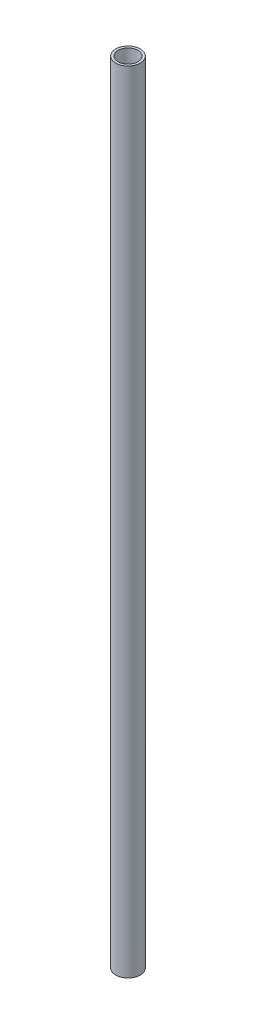
ISO-10303-21;
HEADER;
FILE_DESCRIPTION(('STEP AP214'),'2;1');
FILE_NAME('part.step','',(''),(''),'','','');
FILE_SCHEMA(('AUTOMOTIVE_DESIGN { 1 0 10303 214 1 1 1 1 }'));
ENDSEC;
DATA;
#1=APPLICATION_CONTEXT('core data for automotive mechanical design processes');
#2=APPLICATION_PROTOCOL_DEFINITION('international standard','automotive_design',2000,#1);
#3=PRODUCT_CONTEXT('',#1,'mechanical');
#4=PRODUCT('Part','Part','',(#3));
#5=PRODUCT_RELATED_PRODUCT_CATEGORY('part','',(#4));
#6=PRODUCT_DEFINITION_FORMATION('','',#4);
#7=PRODUCT_DEFINITION_CONTEXT('part definition',#1,'design');
#8=PRODUCT_DEFINITION('design','',#6,#7);
#9=PRODUCT_DEFINITION_SHAPE('','',#8);
#10=(LENGTH_UNIT() NAMED_UNIT(*) SI_UNIT(.MILLI.,.METRE.));
#11=(NAMED_UNIT(*) PLANE_ANGLE_UNIT() SI_UNIT($,.RADIAN.));
#12=(NAMED_UNIT(*) SI_UNIT($,.STERADIAN.) SOLID_ANGLE_UNIT());
#13=UNCERTAINTY_MEASURE_WITH_UNIT(LENGTH_MEASURE(1.E-05),#10,'distance_accuracy_value','');
#14=(GEOMETRIC_REPRESENTATION_CONTEXT(3) GLOBAL_UNCERTAINTY_ASSIGNED_CONTEXT((#13)) GLOBAL_UNIT_ASSIGNED_CONTEXT((#10,
#11,#12)) REPRESENTATION_CONTEXT('',''));
#15=CARTESIAN_POINT('',(0.,0.,0.));
#16=DIRECTION('',(0.,0.,1.));
#17=DIRECTION('',(1.,0.,0.));
#18=AXIS2_PLACEMENT_3D('',#15,#16,#17);
#19=CARTESIAN_POINT('',(0.,0.,0.));
#20=DIRECTION('',(0.,1.,0.));
#21=DIRECTION('',(0.,0.,-1.));
#22=AXIS2_PLACEMENT_3D('',#19,#20,#21);
#23=PLANE('',#22);
#24=CARTESIAN_POINT('',(0.,0.,0.));
#25=DIRECTION('',(0.,-1.,0.));
#26=DIRECTION('',(0.,0.,-1.));
#27=AXIS2_PLACEMENT_3D('',#24,#25,#26);
#28=CIRCLE('',#27,0.3977);
#29=CARTESIAN_POINT('',(0.,0.,-0.3977));
#30=VERTEX_POINT('',#29);
#31=EDGE_CURVE('E40',#30,#30,#28,.T.);
#32=ORIENTED_EDGE('',*,*,#31,.T.);
#33=EDGE_LOOP('',(#32));
#34=FACE_BOUND('',#33,.T.);
#35=CARTESIAN_POINT('',(0.,0.,0.));
#36=DIRECTION('',(0.,-1.,0.));
#37=DIRECTION('',(0.,0.,-1.));
#38=AXIS2_PLACEMENT_3D('',#35,#36,#37);
#39=CIRCLE('',#38,0.3215);
#40=CARTESIAN_POINT('',(0.,0.,-0.3215));
#41=VERTEX_POINT('',#40);
#42=EDGE_CURVE('E49',#41,#41,#39,.T.);
#43=ORIENTED_EDGE('',*,*,#42,.F.);
#44=EDGE_LOOP('',(#43));
#45=FACE_BOUND('',#44,.T.);
#46=ADVANCED_FACE('F33',(#34,#45),#23,.F.);
#47=CARTESIAN_POINT('',(0.,26.6948654675116,0.));
#48=DIRECTION('',(0.,-1.,0.));
#49=DIRECTION('',(0.,0.,1.));
#50=AXIS2_PLACEMENT_3D('',#47,#48,#49);
#51=CYLINDRICAL_SURFACE('',#50,0.3977);
#52=CARTESIAN_POINT('',(0.,25.57,0.));
#53=DIRECTION('',(0.,1.,0.));
#54=DIRECTION('',(0.,0.,1.));
#55=AXIS2_PLACEMENT_3D('',#52,#53,#54);
#56=CIRCLE('',#55,0.3977);
#57=CARTESIAN_POINT('',(0.,25.57,0.3977));
#58=VERTEX_POINT('',#57);
#59=EDGE_CURVE('E44',#58,#58,#56,.T.);
#60=ORIENTED_EDGE('',*,*,#59,.F.);
#61=EDGE_LOOP('',(#60));
#62=FACE_BOUND('',#61,.T.);
#63=ORIENTED_EDGE('',*,*,#31,.F.);
#64=EDGE_LOOP('',(#63));
#65=FACE_BOUND('',#64,.T.);
#66=ADVANCED_FACE('F57',(#62,#65),#51,.T.);
#67=CARTESIAN_POINT('',(0.,26.6948654675116,0.));
#68=DIRECTION('',(0.,-1.,0.));
#69=DIRECTION('',(0.,0.,1.));
#70=AXIS2_PLACEMENT_3D('',#67,#68,#69);
#71=CYLINDRICAL_SURFACE('',#70,0.3215);
#72=CARTESIAN_POINT('',(0.,25.57,0.));
#73=DIRECTION('',(0.,1.,0.));
#74=DIRECTION('',(0.,0.,1.));
#75=AXIS2_PLACEMENT_3D('',#72,#73,#74);
#76=CIRCLE('',#75,0.3215);
#77=CARTESIAN_POINT('',(0.,25.57,0.3215));
#78=VERTEX_POINT('',#77);
#79=EDGE_CURVE('E10',#78,#78,#76,.T.);
#80=ORIENTED_EDGE('',*,*,#79,.T.);
#81=EDGE_LOOP('',(#80));
#82=FACE_BOUND('',#81,.T.);
#83=ORIENTED_EDGE('',*,*,#42,.T.);
#84=EDGE_LOOP('',(#83));
#85=FACE_BOUND('',#84,.T.);
#86=ADVANCED_FACE('F54',(#82,#85),#71,.F.);
#87=CARTESIAN_POINT('',(0.,25.57,0.));
#88=DIRECTION('',(0.,-1.,0.));
#89=DIRECTION('',(-0.228621711480542,0.,0.973515337855397));
#90=AXIS2_PLACEMENT_3D('',#87,#88,#89);
#91=PLANE('',#90);
#92=ORIENTED_EDGE('',*,*,#79,.F.);
#93=EDGE_LOOP('',(#92));
#94=FACE_BOUND('',#93,.T.);
#95=ORIENTED_EDGE('',*,*,#59,.T.);
#96=EDGE_LOOP('',(#95));
#97=FACE_BOUND('',#96,.T.);
#98=ADVANCED_FACE('F35',(#94,#97),#91,.F.);
#99=CLOSED_SHELL('',(#46,#66,#86,#98));
#100=MANIFOLD_SOLID_BREP('B2',#99);
#101=ADVANCED_BREP_SHAPE_REPRESENTATION('',(#18,#100),#14);
#102=SHAPE_DEFINITION_REPRESENTATION(#9,#101);
ENDSEC;
END-ISO-10303-21;
